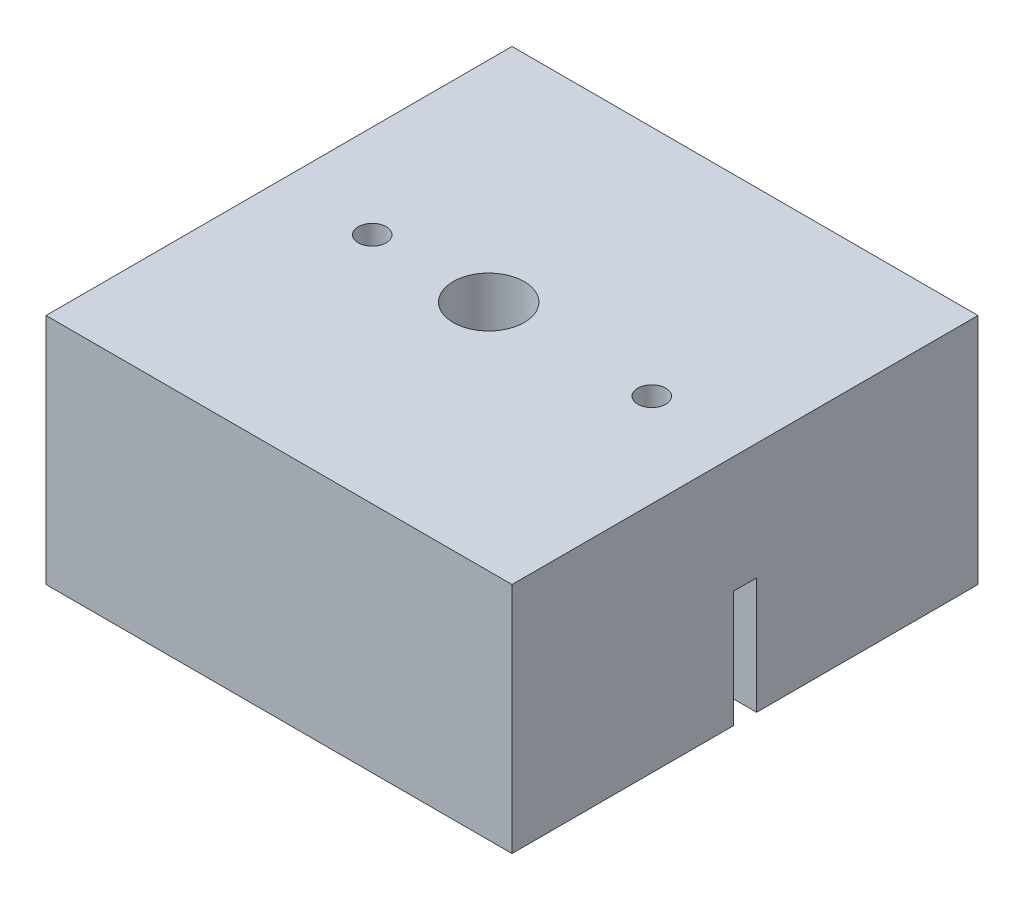
ISO-10303-21;
HEADER;
FILE_DESCRIPTION(('STEP AP214'),'2;1');
FILE_NAME('part.step','',(''),(''),'','','');
FILE_SCHEMA(('AUTOMOTIVE_DESIGN { 1 0 10303 214 1 1 1 1 }'));
ENDSEC;
DATA;
#1=APPLICATION_CONTEXT('core data for automotive mechanical design processes');
#2=APPLICATION_PROTOCOL_DEFINITION('international standard','automotive_design',2000,#1);
#3=PRODUCT_CONTEXT('',#1,'mechanical');
#4=PRODUCT('Part','Part','',(#3));
#5=PRODUCT_RELATED_PRODUCT_CATEGORY('part','',(#4));
#6=PRODUCT_DEFINITION_FORMATION('','',#4);
#7=PRODUCT_DEFINITION_CONTEXT('part definition',#1,'design');
#8=PRODUCT_DEFINITION('design','',#6,#7);
#9=PRODUCT_DEFINITION_SHAPE('','',#8);
#10=(LENGTH_UNIT() NAMED_UNIT(*) SI_UNIT(.MILLI.,.METRE.));
#11=(NAMED_UNIT(*) PLANE_ANGLE_UNIT() SI_UNIT($,.RADIAN.));
#12=(NAMED_UNIT(*) SI_UNIT($,.STERADIAN.) SOLID_ANGLE_UNIT());
#13=UNCERTAINTY_MEASURE_WITH_UNIT(LENGTH_MEASURE(1.E-05),#10,'distance_accuracy_value','');
#14=(GEOMETRIC_REPRESENTATION_CONTEXT(3) GLOBAL_UNCERTAINTY_ASSIGNED_CONTEXT((#13)) GLOBAL_UNIT_ASSIGNED_CONTEXT((#10,
#11,#12)) REPRESENTATION_CONTEXT('',''));
#15=CARTESIAN_POINT('',(0.,0.,0.));
#16=DIRECTION('',(0.,0.,1.));
#17=DIRECTION('',(1.,0.,0.));
#18=AXIS2_PLACEMENT_3D('',#15,#16,#17);
#19=CARTESIAN_POINT('',(0.,0.,0.));
#20=DIRECTION('',(0.,1.,0.));
#21=DIRECTION('',(0.,0.,1.));
#22=AXIS2_PLACEMENT_3D('',#19,#20,#21);
#23=PLANE('',#22);
#24=DIRECTION('',(0.,0.,1.));
#25=VECTOR('',#24,1.);
#26=CARTESIAN_POINT('',(-5.,0.,-5.));
#27=LINE('',#26,#25);
#28=CARTESIAN_POINT('',(-5.,0.,0.25));
#29=VERTEX_POINT('',#28);
#30=CARTESIAN_POINT('',(-5.,0.,5.));
#31=VERTEX_POINT('',#30);
#32=EDGE_CURVE('E234',#29,#31,#27,.T.);
#33=ORIENTED_EDGE('',*,*,#32,.F.);
#34=DIRECTION('',(-1.,0.,0.));
#35=VECTOR('',#34,1.);
#36=CARTESIAN_POINT('',(-5.,0.,0.25));
#37=LINE('',#36,#35);
#38=CARTESIAN_POINT('',(-4.23413638177191,0.,0.25));
#39=VERTEX_POINT('',#38);
#40=EDGE_CURVE('E164',#39,#29,#37,.T.);
#41=ORIENTED_EDGE('',*,*,#40,.F.);
#42=CARTESIAN_POINT('',(-2.27215189873418,0.,0.));
#43=DIRECTION('',(0.,1.,0.));
#44=DIRECTION('',(0.,0.,1.));
#45=AXIS2_PLACEMENT_3D('',#42,#43,#44);
#46=CIRCLE('',#45,1.97784810126582);
#47=CARTESIAN_POINT('',(-2.01785714285714,0.,1.96143245838705));
#48=VERTEX_POINT('',#47);
#49=EDGE_CURVE('E186',#39,#48,#46,.T.);
#50=ORIENTED_EDGE('',*,*,#49,.T.);
#51=DIRECTION('',(0.991700250960492,0.,-0.128571428571429));
#52=VECTOR('',#51,1.);
#53=CARTESIAN_POINT('',(-2.01785714285714,0.,1.96143245838705));
#54=LINE('',#53,#52);
#55=CARTESIAN_POINT('',(3.11071428571428,0.,1.29652614777212));
#56=VERTEX_POINT('',#55);
#57=EDGE_CURVE('E203',#48,#56,#54,.T.);
#58=ORIENTED_EDGE('',*,*,#57,.T.);
#59=CARTESIAN_POINT('',(2.94262295081967,0.,0.));
#60=DIRECTION('',(0.,-1.,0.));
#61=DIRECTION('',(0.,0.,-1.));
#62=AXIS2_PLACEMENT_3D('',#59,#60,#61);
#63=CIRCLE('',#62,1.30737704918033);
#64=CARTESIAN_POINT('',(4.2258745819207,0.,0.25));
#65=VERTEX_POINT('',#64);
#66=EDGE_CURVE('E206',#65,#56,#63,.T.);
#67=ORIENTED_EDGE('',*,*,#66,.F.);
#68=CARTESIAN_POINT('',(5.,0.,0.25));
#69=VERTEX_POINT('',#68);
#70=EDGE_CURVE('E288',#69,#65,#37,.T.);
#71=ORIENTED_EDGE('',*,*,#70,.F.);
#72=DIRECTION('',(0.,0.,-1.));
#73=VECTOR('',#72,1.);
#74=CARTESIAN_POINT('',(5.,0.,-5.));
#75=LINE('',#74,#73);
#76=CARTESIAN_POINT('',(5.,0.,5.));
#77=VERTEX_POINT('',#76);
#78=EDGE_CURVE('E256',#77,#69,#75,.T.);
#79=ORIENTED_EDGE('',*,*,#78,.F.);
#80=DIRECTION('',(1.,0.,0.));
#81=VECTOR('',#80,1.);
#82=CARTESIAN_POINT('',(-5.,0.,5.));
#83=LINE('',#82,#81);
#84=EDGE_CURVE('E253',#31,#77,#83,.T.);
#85=ORIENTED_EDGE('',*,*,#84,.F.);
#86=EDGE_LOOP('',(#33,#41,#50,#58,#67,#71,#79,#85));
#87=FACE_BOUND('',#86,.T.);
#88=ADVANCED_FACE('F33',(#87),#23,.F.);
#89=CARTESIAN_POINT('',(-2.27215189873418,2.5,0.));
#90=DIRECTION('',(0.,-1.,0.));
#91=DIRECTION('',(0.,0.,-1.));
#92=AXIS2_PLACEMENT_3D('',#89,#90,#91);
#93=CYLINDRICAL_SURFACE('',#92,1.97784810126582);
#94=DIRECTION('',(0.,-1.,0.));
#95=VECTOR('',#94,1.);
#96=CARTESIAN_POINT('',(-4.23413638177191,2.5,0.25));
#97=LINE('',#96,#95);
#98=CARTESIAN_POINT('',(-4.23413638177191,2.5,0.25));
#99=VERTEX_POINT('',#98);
#100=EDGE_CURVE('E184',#99,#39,#97,.T.);
#101=ORIENTED_EDGE('',*,*,#100,.F.);
#102=CARTESIAN_POINT('',(-2.27215189873418,2.5,0.));
#103=DIRECTION('',(0.,1.,0.));
#104=DIRECTION('',(0.,0.,1.));
#105=AXIS2_PLACEMENT_3D('',#102,#103,#104);
#106=CIRCLE('',#105,1.97784810126582);
#107=CARTESIAN_POINT('',(-2.01785714285714,2.5,1.96143245838705));
#108=VERTEX_POINT('',#107);
#109=EDGE_CURVE('E155',#99,#108,#106,.T.);
#110=ORIENTED_EDGE('',*,*,#109,.T.);
#111=DIRECTION('',(0.,-1.,0.));
#112=VECTOR('',#111,1.);
#113=CARTESIAN_POINT('',(-2.01785714285714,2.5,1.96143245838705));
#114=LINE('',#113,#112);
#115=EDGE_CURVE('E220',#108,#48,#114,.T.);
#116=ORIENTED_EDGE('',*,*,#115,.T.);
#117=ORIENTED_EDGE('',*,*,#49,.F.);
#118=EDGE_LOOP('',(#101,#110,#116,#117));
#119=FACE_BOUND('',#118,.T.);
#120=ADVANCED_FACE('F313',(#119),#93,.F.);
#121=CARTESIAN_POINT('',(2.94262295081967,2.5,0.));
#122=DIRECTION('',(0.,-1.,0.));
#123=DIRECTION('',(0.,0.,-1.));
#124=AXIS2_PLACEMENT_3D('',#121,#122,#123);
#125=CYLINDRICAL_SURFACE('',#124,1.30737704918033);
#126=CARTESIAN_POINT('',(2.94262295081967,2.5,0.));
#127=DIRECTION('',(0.,-1.,0.));
#128=DIRECTION('',(0.,0.,-1.));
#129=AXIS2_PLACEMENT_3D('',#126,#127,#128);
#130=CIRCLE('',#129,1.30737704918033);
#131=CARTESIAN_POINT('',(4.2258745819207,2.5,0.25));
#132=VERTEX_POINT('',#131);
#133=CARTESIAN_POINT('',(3.11071428571428,2.5,1.29652614777212));
#134=VERTEX_POINT('',#133);
#135=EDGE_CURVE('E193',#132,#134,#130,.T.);
#136=ORIENTED_EDGE('',*,*,#135,.F.);
#137=DIRECTION('',(0.,-1.,0.));
#138=VECTOR('',#137,1.);
#139=CARTESIAN_POINT('',(4.2258745819207,2.5,0.25));
#140=LINE('',#139,#138);
#141=EDGE_CURVE('E11',#132,#65,#140,.T.);
#142=ORIENTED_EDGE('',*,*,#141,.T.);
#143=ORIENTED_EDGE('',*,*,#66,.T.);
#144=DIRECTION('',(0.,-1.,0.));
#145=VECTOR('',#144,1.);
#146=CARTESIAN_POINT('',(3.11071428571428,2.5,1.29652614777212));
#147=LINE('',#146,#145);
#148=EDGE_CURVE('E217',#134,#56,#147,.T.);
#149=ORIENTED_EDGE('',*,*,#148,.F.);
#150=EDGE_LOOP('',(#136,#142,#143,#149));
#151=FACE_BOUND('',#150,.T.);
#152=ADVANCED_FACE('F307',(#151),#125,.F.);
#153=CARTESIAN_POINT('',(5.,0.,-0.25));
#154=VERTEX_POINT('',#153);
#155=CARTESIAN_POINT('',(5.,0.,-5.));
#156=VERTEX_POINT('',#155);
#157=EDGE_CURVE('E255',#154,#156,#75,.T.);
#158=ORIENTED_EDGE('',*,*,#157,.F.);
#159=DIRECTION('',(1.,0.,0.));
#160=VECTOR('',#159,1.);
#161=CARTESIAN_POINT('',(5.,0.,-0.25));
#162=LINE('',#161,#160);
#163=CARTESIAN_POINT('',(4.2258745819207,0.,-0.25));
#164=VERTEX_POINT('',#163);
#165=EDGE_CURVE('E286',#164,#154,#162,.T.);
#166=ORIENTED_EDGE('',*,*,#165,.F.);
#167=CARTESIAN_POINT('',(3.11071428571428,0.,-1.29652614777212));
#168=VERTEX_POINT('',#167);
#169=EDGE_CURVE('E207',#168,#164,#63,.T.);
#170=ORIENTED_EDGE('',*,*,#169,.F.);
#171=DIRECTION('',(0.991700250960492,0.,0.128571428571429));
#172=VECTOR('',#171,1.);
#173=CARTESIAN_POINT('',(-2.01785714285714,0.,-1.96143245838705));
#174=LINE('',#173,#172);
#175=CARTESIAN_POINT('',(-2.01785714285714,0.,-1.96143245838705));
#176=VERTEX_POINT('',#175);
#177=EDGE_CURVE('E210',#176,#168,#174,.T.);
#178=ORIENTED_EDGE('',*,*,#177,.F.);
#179=CARTESIAN_POINT('',(-4.23413638177191,0.,-0.25));
#180=VERTEX_POINT('',#179);
#181=EDGE_CURVE('E200',#176,#180,#46,.T.);
#182=ORIENTED_EDGE('',*,*,#181,.T.);
#183=CARTESIAN_POINT('',(-5.,0.,-0.25));
#184=VERTEX_POINT('',#183);
#185=EDGE_CURVE('E48',#184,#180,#162,.T.);
#186=ORIENTED_EDGE('',*,*,#185,.F.);
#187=CARTESIAN_POINT('',(-5.,0.,-5.));
#188=VERTEX_POINT('',#187);
#189=EDGE_CURVE('E251',#188,#184,#27,.T.);
#190=ORIENTED_EDGE('',*,*,#189,.F.);
#191=DIRECTION('',(-1.,0.,0.));
#192=VECTOR('',#191,1.);
#193=CARTESIAN_POINT('',(-5.,0.,-5.));
#194=LINE('',#193,#192);
#195=EDGE_CURVE('E244',#156,#188,#194,.T.);
#196=ORIENTED_EDGE('',*,*,#195,.F.);
#197=EDGE_LOOP('',(#158,#166,#170,#178,#182,#186,#190,#196));
#198=FACE_BOUND('',#197,.T.);
#199=ADVANCED_FACE('F285',(#198),#23,.F.);
#200=CARTESIAN_POINT('',(-5.,5.,-5.));
#201=DIRECTION('',(1.,0.,0.));
#202=DIRECTION('',(0.,0.,-1.));
#203=AXIS2_PLACEMENT_3D('',#200,#201,#202);
#204=PLANE('',#203);
#205=DIRECTION('',(0.,0.,-1.));
#206=VECTOR('',#205,1.);
#207=CARTESIAN_POINT('',(-5.,2.5,-0.25));
#208=LINE('',#207,#206);
#209=CARTESIAN_POINT('',(-5.,2.5,0.25));
#210=VERTEX_POINT('',#209);
#211=CARTESIAN_POINT('',(-5.,2.5,-0.25));
#212=VERTEX_POINT('',#211);
#213=EDGE_CURVE('E152',#210,#212,#208,.T.);
#214=ORIENTED_EDGE('',*,*,#213,.F.);
#215=DIRECTION('',(0.,-1.,0.));
#216=VECTOR('',#215,1.);
#217=CARTESIAN_POINT('',(-5.,12.5124921972504,0.25));
#218=LINE('',#217,#216);
#219=EDGE_CURVE('E161',#210,#29,#218,.T.);
#220=ORIENTED_EDGE('',*,*,#219,.T.);
#221=ORIENTED_EDGE('',*,*,#32,.T.);
#222=DIRECTION('',(0.,-1.,0.));
#223=VECTOR('',#222,1.);
#224=CARTESIAN_POINT('',(-5.,5.,5.));
#225=LINE('',#224,#223);
#226=CARTESIAN_POINT('',(-5.,5.,5.));
#227=VERTEX_POINT('',#226);
#228=EDGE_CURVE('E268',#227,#31,#225,.T.);
#229=ORIENTED_EDGE('',*,*,#228,.F.);
#230=DIRECTION('',(0.,0.,1.));
#231=VECTOR('',#230,1.);
#232=CARTESIAN_POINT('',(-5.,5.,-5.));
#233=LINE('',#232,#231);
#234=CARTESIAN_POINT('',(-5.,5.,-5.));
#235=VERTEX_POINT('',#234);
#236=EDGE_CURVE('E240',#235,#227,#233,.T.);
#237=ORIENTED_EDGE('',*,*,#236,.F.);
#238=DIRECTION('',(0.,-1.,0.));
#239=VECTOR('',#238,1.);
#240=CARTESIAN_POINT('',(-5.,5.,-5.));
#241=LINE('',#240,#239);
#242=EDGE_CURVE('E250',#235,#188,#241,.T.);
#243=ORIENTED_EDGE('',*,*,#242,.T.);
#244=ORIENTED_EDGE('',*,*,#189,.T.);
#245=DIRECTION('',(0.,-1.,0.));
#246=VECTOR('',#245,1.);
#247=CARTESIAN_POINT('',(-5.,12.5124921972504,-0.25));
#248=LINE('',#247,#246);
#249=EDGE_CURVE('E169',#212,#184,#248,.T.);
#250=ORIENTED_EDGE('',*,*,#249,.F.);
#251=EDGE_LOOP('',(#214,#220,#221,#229,#237,#243,#244,#250));
#252=FACE_BOUND('',#251,.T.);
#253=ADVANCED_FACE('F35',(#252),#204,.F.);
#254=CARTESIAN_POINT('',(-5.,5.,5.));
#255=DIRECTION('',(0.,0.,-1.));
#256=DIRECTION('',(-1.,0.,0.));
#257=AXIS2_PLACEMENT_3D('',#254,#255,#256);
#258=PLANE('',#257);
#259=ORIENTED_EDGE('',*,*,#84,.T.);
#260=DIRECTION('',(0.,-1.,0.));
#261=VECTOR('',#260,1.);
#262=CARTESIAN_POINT('',(5.,5.,5.));
#263=LINE('',#262,#261);
#264=CARTESIAN_POINT('',(5.,5.,5.));
#265=VERTEX_POINT('',#264);
#266=EDGE_CURVE('E265',#265,#77,#263,.T.);
#267=ORIENTED_EDGE('',*,*,#266,.F.);
#268=DIRECTION('',(1.,0.,0.));
#269=VECTOR('',#268,1.);
#270=CARTESIAN_POINT('',(-5.,5.,5.));
#271=LINE('',#270,#269);
#272=EDGE_CURVE('E243',#227,#265,#271,.T.);
#273=ORIENTED_EDGE('',*,*,#272,.F.);
#274=ORIENTED_EDGE('',*,*,#228,.T.);
#275=EDGE_LOOP('',(#259,#267,#273,#274));
#276=FACE_BOUND('',#275,.T.);
#277=ADVANCED_FACE('F317',(#276),#258,.F.);
#278=CARTESIAN_POINT('',(5.,5.,-5.));
#279=DIRECTION('',(-1.,0.,0.));
#280=DIRECTION('',(0.,0.,1.));
#281=AXIS2_PLACEMENT_3D('',#278,#279,#280);
#282=PLANE('',#281);
#283=ORIENTED_EDGE('',*,*,#78,.T.);
#284=DIRECTION('',(0.,-1.,0.));
#285=VECTOR('',#284,1.);
#286=CARTESIAN_POINT('',(5.,12.5124921972504,0.25));
#287=LINE('',#286,#285);
#288=CARTESIAN_POINT('',(5.,2.5,0.25));
#289=VERTEX_POINT('',#288);
#290=EDGE_CURVE('E180',#289,#69,#287,.T.);
#291=ORIENTED_EDGE('',*,*,#290,.F.);
#292=DIRECTION('',(0.,0.,1.));
#293=VECTOR('',#292,1.);
#294=CARTESIAN_POINT('',(5.,2.5,0.25));
#295=LINE('',#294,#293);
#296=CARTESIAN_POINT('',(5.,2.5,-0.25));
#297=VERTEX_POINT('',#296);
#298=EDGE_CURVE('E178',#297,#289,#295,.T.);
#299=ORIENTED_EDGE('',*,*,#298,.F.);
#300=DIRECTION('',(0.,-1.,0.));
#301=VECTOR('',#300,1.);
#302=CARTESIAN_POINT('',(5.,12.5124921972504,-0.25));
#303=LINE('',#302,#301);
#304=EDGE_CURVE('E176',#297,#154,#303,.T.);
#305=ORIENTED_EDGE('',*,*,#304,.T.);
#306=ORIENTED_EDGE('',*,*,#157,.T.);
#307=DIRECTION('',(0.,-1.,0.));
#308=VECTOR('',#307,1.);
#309=CARTESIAN_POINT('',(5.,5.,-5.));
#310=LINE('',#309,#308);
#311=CARTESIAN_POINT('',(5.,5.,-5.));
#312=VERTEX_POINT('',#311);
#313=EDGE_CURVE('E262',#312,#156,#310,.T.);
#314=ORIENTED_EDGE('',*,*,#313,.F.);
#315=DIRECTION('',(0.,0.,-1.));
#316=VECTOR('',#315,1.);
#317=CARTESIAN_POINT('',(5.,5.,-5.));
#318=LINE('',#317,#316);
#319=EDGE_CURVE('E246',#265,#312,#318,.T.);
#320=ORIENTED_EDGE('',*,*,#319,.F.);
#321=ORIENTED_EDGE('',*,*,#266,.T.);
#322=EDGE_LOOP('',(#283,#291,#299,#305,#306,#314,#320,#321));
#323=FACE_BOUND('',#322,.T.);
#324=ADVANCED_FACE('F296',(#323),#282,.F.);
#325=CARTESIAN_POINT('',(-5.,5.,-5.));
#326=DIRECTION('',(0.,0.,1.));
#327=DIRECTION('',(1.,0.,0.));
#328=AXIS2_PLACEMENT_3D('',#325,#326,#327);
#329=PLANE('',#328);
#330=ORIENTED_EDGE('',*,*,#195,.T.);
#331=ORIENTED_EDGE('',*,*,#242,.F.);
#332=DIRECTION('',(-1.,0.,0.));
#333=VECTOR('',#332,1.);
#334=CARTESIAN_POINT('',(-5.,5.,-5.));
#335=LINE('',#334,#333);
#336=EDGE_CURVE('E248',#312,#235,#335,.T.);
#337=ORIENTED_EDGE('',*,*,#336,.F.);
#338=ORIENTED_EDGE('',*,*,#313,.T.);
#339=EDGE_LOOP('',(#330,#331,#337,#338));
#340=FACE_BOUND('',#339,.T.);
#341=ADVANCED_FACE('F326',(#340),#329,.F.);
#342=CARTESIAN_POINT('',(0.,5.,0.));
#343=DIRECTION('',(0.,1.,0.));
#344=DIRECTION('',(0.,0.,1.));
#345=AXIS2_PLACEMENT_3D('',#342,#343,#344);
#346=PLANE('',#345);
#347=CARTESIAN_POINT('',(3.,5.,0.));
#348=DIRECTION('',(0.,-1.,0.));
#349=DIRECTION('',(0.,0.,-1.));
#350=AXIS2_PLACEMENT_3D('',#347,#348,#349);
#351=CIRCLE('',#350,0.3);
#352=CARTESIAN_POINT('',(3.,5.,-0.300000000000001));
#353=VERTEX_POINT('',#352);
#354=EDGE_CURVE('E231',#353,#353,#351,.T.);
#355=ORIENTED_EDGE('',*,*,#354,.T.);
#356=EDGE_LOOP('',(#355));
#357=FACE_BOUND('',#356,.T.);
#358=CARTESIAN_POINT('',(-0.5,5.,0.));
#359=DIRECTION('',(0.,-1.,0.));
#360=DIRECTION('',(0.,0.,-1.));
#361=AXIS2_PLACEMENT_3D('',#358,#359,#360);
#362=CIRCLE('',#361,0.762);
#363=CARTESIAN_POINT('',(-0.5,5.,-0.762));
#364=VERTEX_POINT('',#363);
#365=EDGE_CURVE('E235',#364,#364,#362,.T.);
#366=ORIENTED_EDGE('',*,*,#365,.T.);
#367=EDGE_LOOP('',(#366));
#368=FACE_BOUND('',#367,.T.);
#369=CARTESIAN_POINT('',(-3.,5.,0.));
#370=DIRECTION('',(0.,-1.,0.));
#371=DIRECTION('',(0.,0.,-1.));
#372=AXIS2_PLACEMENT_3D('',#369,#370,#371);
#373=CIRCLE('',#372,0.3);
#374=CARTESIAN_POINT('',(-3.,5.,-0.300000000000001));
#375=VERTEX_POINT('',#374);
#376=EDGE_CURVE('E230',#375,#375,#373,.T.);
#377=ORIENTED_EDGE('',*,*,#376,.T.);
#378=EDGE_LOOP('',(#377));
#379=FACE_BOUND('',#378,.T.);
#380=ORIENTED_EDGE('',*,*,#236,.T.);
#381=ORIENTED_EDGE('',*,*,#272,.T.);
#382=ORIENTED_EDGE('',*,*,#319,.T.);
#383=ORIENTED_EDGE('',*,*,#336,.T.);
#384=EDGE_LOOP('',(#380,#381,#382,#383));
#385=FACE_BOUND('',#384,.T.);
#386=ADVANCED_FACE('F321',(#357,#368,#379,#385),#346,.T.);
#387=CARTESIAN_POINT('',(-3.,5.,0.));
#388=DIRECTION('',(0.,-1.,0.));
#389=DIRECTION('',(0.,0.,-1.));
#390=AXIS2_PLACEMENT_3D('',#387,#388,#389);
#391=CYLINDRICAL_SURFACE('',#390,0.3);
#392=CARTESIAN_POINT('',(-3.,2.5,0.));
#393=DIRECTION('',(0.,1.,0.));
#394=DIRECTION('',(0.,0.,1.));
#395=AXIS2_PLACEMENT_3D('',#392,#393,#394);
#396=CIRCLE('',#395,0.3);
#397=CARTESIAN_POINT('',(-3.,2.5,0.3));
#398=VERTEX_POINT('',#397);
#399=EDGE_CURVE('E227',#398,#398,#396,.F.);
#400=ORIENTED_EDGE('',*,*,#399,.T.);
#401=EDGE_LOOP('',(#400));
#402=FACE_BOUND('',#401,.T.);
#403=ORIENTED_EDGE('',*,*,#376,.F.);
#404=EDGE_LOOP('',(#403));
#405=FACE_BOUND('',#404,.T.);
#406=ADVANCED_FACE('F373',(#402,#405),#391,.F.);
#407=CARTESIAN_POINT('',(-0.5,5.,0.));
#408=DIRECTION('',(0.,-1.,0.));
#409=DIRECTION('',(0.,0.,-1.));
#410=AXIS2_PLACEMENT_3D('',#407,#408,#409);
#411=CYLINDRICAL_SURFACE('',#410,0.762);
#412=CARTESIAN_POINT('',(-0.5,2.5,0.));
#413=DIRECTION('',(0.,1.,0.));
#414=DIRECTION('',(0.,0.,1.));
#415=AXIS2_PLACEMENT_3D('',#412,#413,#414);
#416=CIRCLE('',#415,0.762);
#417=CARTESIAN_POINT('',(-0.5,2.5,0.762));
#418=VERTEX_POINT('',#417);
#419=EDGE_CURVE('E224',#418,#418,#416,.F.);
#420=ORIENTED_EDGE('',*,*,#419,.T.);
#421=EDGE_LOOP('',(#420));
#422=FACE_BOUND('',#421,.T.);
#423=ORIENTED_EDGE('',*,*,#365,.F.);
#424=EDGE_LOOP('',(#423));
#425=FACE_BOUND('',#424,.T.);
#426=ADVANCED_FACE('F369',(#422,#425),#411,.F.);
#427=CARTESIAN_POINT('',(3.,5.,0.));
#428=DIRECTION('',(0.,-1.,0.));
#429=DIRECTION('',(0.,0.,-1.));
#430=AXIS2_PLACEMENT_3D('',#427,#428,#429);
#431=CYLINDRICAL_SURFACE('',#430,0.3);
#432=CARTESIAN_POINT('',(3.,2.5,0.));
#433=DIRECTION('',(0.,1.,0.));
#434=DIRECTION('',(0.,0.,1.));
#435=AXIS2_PLACEMENT_3D('',#432,#433,#434);
#436=CIRCLE('',#435,0.3);
#437=CARTESIAN_POINT('',(3.,2.5,0.3));
#438=VERTEX_POINT('',#437);
#439=EDGE_CURVE('E223',#438,#438,#436,.F.);
#440=ORIENTED_EDGE('',*,*,#439,.T.);
#441=EDGE_LOOP('',(#440));
#442=FACE_BOUND('',#441,.T.);
#443=ORIENTED_EDGE('',*,*,#354,.F.);
#444=EDGE_LOOP('',(#443));
#445=FACE_BOUND('',#444,.T.);
#446=ADVANCED_FACE('F366',(#442,#445),#431,.F.);
#447=CARTESIAN_POINT('',(-2.27215189873418,2.5,0.));
#448=DIRECTION('',(0.,1.,0.));
#449=DIRECTION('',(0.,0.,1.));
#450=AXIS2_PLACEMENT_3D('',#447,#448,#449);
#451=PLANE('',#450);
#452=ORIENTED_EDGE('',*,*,#399,.F.);
#453=EDGE_LOOP('',(#452));
#454=FACE_BOUND('',#453,.T.);
#455=ORIENTED_EDGE('',*,*,#419,.F.);
#456=EDGE_LOOP('',(#455));
#457=FACE_BOUND('',#456,.T.);
#458=ORIENTED_EDGE('',*,*,#439,.F.);
#459=EDGE_LOOP('',(#458));
#460=FACE_BOUND('',#459,.T.);
#461=CARTESIAN_POINT('',(3.11071428571428,2.5,-1.29652614777212));
#462=VERTEX_POINT('',#461);
#463=CARTESIAN_POINT('',(4.2258745819207,2.5,-0.25));
#464=VERTEX_POINT('',#463);
#465=EDGE_CURVE('E194',#462,#464,#130,.T.);
#466=ORIENTED_EDGE('',*,*,#465,.T.);
#467=DIRECTION('',(1.,0.,0.));
#468=VECTOR('',#467,1.);
#469=CARTESIAN_POINT('',(5.,2.5,-0.25));
#470=LINE('',#469,#468);
#471=EDGE_CURVE('E56',#464,#297,#470,.T.);
#472=ORIENTED_EDGE('',*,*,#471,.T.);
#473=ORIENTED_EDGE('',*,*,#298,.T.);
#474=DIRECTION('',(-1.,0.,0.));
#475=VECTOR('',#474,1.);
#476=CARTESIAN_POINT('',(-5.,2.5,0.25));
#477=LINE('',#476,#475);
#478=EDGE_CURVE('E158',#289,#132,#477,.T.);
#479=ORIENTED_EDGE('',*,*,#478,.T.);
#480=ORIENTED_EDGE('',*,*,#135,.T.);
#481=DIRECTION('',(0.991700250960492,0.,-0.128571428571429));
#482=VECTOR('',#481,1.);
#483=CARTESIAN_POINT('',(-2.01785714285714,2.5,1.96143245838705));
#484=LINE('',#483,#482);
#485=EDGE_CURVE('E190',#108,#134,#484,.T.);
#486=ORIENTED_EDGE('',*,*,#485,.F.);
#487=ORIENTED_EDGE('',*,*,#109,.F.);
#488=EDGE_CURVE('E146',#99,#210,#477,.T.);
#489=ORIENTED_EDGE('',*,*,#488,.T.);
#490=ORIENTED_EDGE('',*,*,#213,.T.);
#491=CARTESIAN_POINT('',(-4.23413638177191,2.5,-0.25));
#492=VERTEX_POINT('',#491);
#493=EDGE_CURVE('E174',#212,#492,#470,.T.);
#494=ORIENTED_EDGE('',*,*,#493,.T.);
#495=CARTESIAN_POINT('',(-2.01785714285714,2.5,-1.96143245838705));
#496=VERTEX_POINT('',#495);
#497=EDGE_CURVE('E187',#496,#492,#106,.T.);
#498=ORIENTED_EDGE('',*,*,#497,.F.);
#499=DIRECTION('',(0.991700250960492,0.,0.128571428571429));
#500=VECTOR('',#499,1.);
#501=CARTESIAN_POINT('',(-2.01785714285714,2.5,-1.96143245838705));
#502=LINE('',#501,#500);
#503=EDGE_CURVE('E196',#496,#462,#502,.T.);
#504=ORIENTED_EDGE('',*,*,#503,.T.);
#505=EDGE_LOOP('',(#466,#472,#473,#479,#480,#486,#487,#489,#490,#494,#498,#504));
#506=FACE_BOUND('',#505,.T.);
#507=ADVANCED_FACE('F149',(#454,#457,#460,#506),#451,.F.);
#508=DIRECTION('',(0.,-1.,0.));
#509=VECTOR('',#508,1.);
#510=CARTESIAN_POINT('',(-4.23413638177191,2.5,-0.25));
#511=LINE('',#510,#509);
#512=EDGE_CURVE('E182',#180,#492,#511,.F.);
#513=ORIENTED_EDGE('',*,*,#512,.F.);
#514=ORIENTED_EDGE('',*,*,#181,.F.);
#515=DIRECTION('',(0.,-1.,0.));
#516=VECTOR('',#515,1.);
#517=CARTESIAN_POINT('',(-2.01785714285714,2.5,-1.96143245838705));
#518=LINE('',#517,#516);
#519=EDGE_CURVE('E199',#496,#176,#518,.T.);
#520=ORIENTED_EDGE('',*,*,#519,.F.);
#521=ORIENTED_EDGE('',*,*,#497,.T.);
#522=EDGE_LOOP('',(#513,#514,#520,#521));
#523=FACE_BOUND('',#522,.T.);
#524=ADVANCED_FACE('F329',(#523),#93,.F.);
#525=CARTESIAN_POINT('',(-2.01785714285714,2.5,1.96143245838705));
#526=DIRECTION('',(-0.128571428571429,0.,-0.991700250960492));
#527=DIRECTION('',(-0.991700250960492,0.,0.128571428571429));
#528=AXIS2_PLACEMENT_3D('',#525,#526,#527);
#529=PLANE('',#528);
#530=ORIENTED_EDGE('',*,*,#57,.F.);
#531=ORIENTED_EDGE('',*,*,#115,.F.);
#532=ORIENTED_EDGE('',*,*,#485,.T.);
#533=ORIENTED_EDGE('',*,*,#148,.T.);
#534=EDGE_LOOP('',(#530,#531,#532,#533));
#535=FACE_BOUND('',#534,.T.);
#536=ADVANCED_FACE('F309',(#535),#529,.T.);
#537=ORIENTED_EDGE('',*,*,#169,.T.);
#538=DIRECTION('',(0.,-1.,0.));
#539=VECTOR('',#538,1.);
#540=CARTESIAN_POINT('',(4.2258745819207,2.5,-0.25));
#541=LINE('',#540,#539);
#542=EDGE_CURVE('E41',#164,#464,#541,.F.);
#543=ORIENTED_EDGE('',*,*,#542,.T.);
#544=ORIENTED_EDGE('',*,*,#465,.F.);
#545=DIRECTION('',(0.,-1.,0.));
#546=VECTOR('',#545,1.);
#547=CARTESIAN_POINT('',(3.11071428571428,2.5,-1.29652614777212));
#548=LINE('',#547,#546);
#549=EDGE_CURVE('E215',#462,#168,#548,.T.);
#550=ORIENTED_EDGE('',*,*,#549,.T.);
#551=EDGE_LOOP('',(#537,#543,#544,#550));
#552=FACE_BOUND('',#551,.T.);
#553=ADVANCED_FACE('F274',(#552),#125,.F.);
#554=CARTESIAN_POINT('',(-2.01785714285714,2.5,-1.96143245838705));
#555=DIRECTION('',(0.128571428571429,0.,-0.991700250960492));
#556=DIRECTION('',(-0.991700250960492,0.,-0.128571428571429));
#557=AXIS2_PLACEMENT_3D('',#554,#555,#556);
#558=PLANE('',#557);
#559=ORIENTED_EDGE('',*,*,#177,.T.);
#560=ORIENTED_EDGE('',*,*,#549,.F.);
#561=ORIENTED_EDGE('',*,*,#503,.F.);
#562=ORIENTED_EDGE('',*,*,#519,.T.);
#563=EDGE_LOOP('',(#559,#560,#561,#562));
#564=FACE_BOUND('',#563,.T.);
#565=ADVANCED_FACE('F281',(#564),#558,.F.);
#566=CARTESIAN_POINT('',(-5.,12.5124921972504,0.25));
#567=DIRECTION('',(0.,0.,1.));
#568=DIRECTION('',(1.,0.,0.));
#569=AXIS2_PLACEMENT_3D('',#566,#567,#568);
#570=PLANE('',#569);
#571=ORIENTED_EDGE('',*,*,#478,.F.);
#572=ORIENTED_EDGE('',*,*,#290,.T.);
#573=ORIENTED_EDGE('',*,*,#70,.T.);
#574=ORIENTED_EDGE('',*,*,#141,.F.);
#575=EDGE_LOOP('',(#571,#572,#573,#574));
#576=FACE_BOUND('',#575,.T.);
#577=ADVANCED_FACE('F300',(#576),#570,.F.);
#578=CARTESIAN_POINT('',(5.,12.5124921972504,-0.25));
#579=DIRECTION('',(0.,0.,-1.));
#580=DIRECTION('',(-1.,0.,0.));
#581=AXIS2_PLACEMENT_3D('',#578,#579,#580);
#582=PLANE('',#581);
#583=ORIENTED_EDGE('',*,*,#165,.T.);
#584=ORIENTED_EDGE('',*,*,#304,.F.);
#585=ORIENTED_EDGE('',*,*,#471,.F.);
#586=ORIENTED_EDGE('',*,*,#542,.F.);
#587=EDGE_LOOP('',(#583,#584,#585,#586));
#588=FACE_BOUND('',#587,.T.);
#589=ADVANCED_FACE('F333',(#588),#582,.F.);
#590=ORIENTED_EDGE('',*,*,#100,.T.);
#591=ORIENTED_EDGE('',*,*,#40,.T.);
#592=ORIENTED_EDGE('',*,*,#219,.F.);
#593=ORIENTED_EDGE('',*,*,#488,.F.);
#594=EDGE_LOOP('',(#590,#591,#592,#593));
#595=FACE_BOUND('',#594,.T.);
#596=ADVANCED_FACE('F162',(#595),#570,.F.);
#597=ORIENTED_EDGE('',*,*,#512,.T.);
#598=ORIENTED_EDGE('',*,*,#493,.F.);
#599=ORIENTED_EDGE('',*,*,#249,.T.);
#600=ORIENTED_EDGE('',*,*,#185,.T.);
#601=EDGE_LOOP('',(#597,#598,#599,#600));
#602=FACE_BOUND('',#601,.T.);
#603=ADVANCED_FACE('F330',(#602),#582,.F.);
#604=CLOSED_SHELL('',(#88,#120,#152,#199,#253,#277,#324,#341,#386,#406,#426,#446,#507,#524,#536,
#553,#565,#577,#589,#596,#603));
#605=MANIFOLD_SOLID_BREP('B2',#604);
#606=ADVANCED_BREP_SHAPE_REPRESENTATION('',(#18,#605),#14);
#607=SHAPE_DEFINITION_REPRESENTATION(#9,#606);
ENDSEC;
END-ISO-10303-21;
